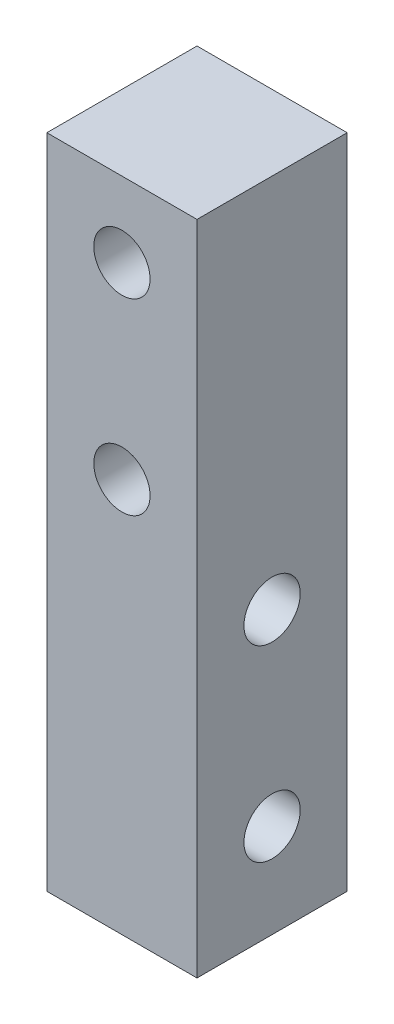
ISO-10303-21;
HEADER;
FILE_DESCRIPTION(('STEP AP214'),'2;1');
FILE_NAME('part.step','',(''),(''),'','','');
FILE_SCHEMA(('AUTOMOTIVE_DESIGN { 1 0 10303 214 1 1 1 1 }'));
ENDSEC;
DATA;
#1=APPLICATION_CONTEXT('core data for automotive mechanical design processes');
#2=APPLICATION_PROTOCOL_DEFINITION('international standard','automotive_design',2000,#1);
#3=PRODUCT_CONTEXT('',#1,'mechanical');
#4=PRODUCT('Part','Part','',(#3));
#5=PRODUCT_RELATED_PRODUCT_CATEGORY('part','',(#4));
#6=PRODUCT_DEFINITION_FORMATION('','',#4);
#7=PRODUCT_DEFINITION_CONTEXT('part definition',#1,'design');
#8=PRODUCT_DEFINITION('design','',#6,#7);
#9=PRODUCT_DEFINITION_SHAPE('','',#8);
#10=(LENGTH_UNIT() NAMED_UNIT(*) SI_UNIT(.MILLI.,.METRE.));
#11=(NAMED_UNIT(*) PLANE_ANGLE_UNIT() SI_UNIT($,.RADIAN.));
#12=(NAMED_UNIT(*) SI_UNIT($,.STERADIAN.) SOLID_ANGLE_UNIT());
#13=UNCERTAINTY_MEASURE_WITH_UNIT(LENGTH_MEASURE(1.E-05),#10,'distance_accuracy_value','');
#14=(GEOMETRIC_REPRESENTATION_CONTEXT(3) GLOBAL_UNCERTAINTY_ASSIGNED_CONTEXT((#13)) GLOBAL_UNIT_ASSIGNED_CONTEXT((#10,
#11,#12)) REPRESENTATION_CONTEXT('',''));
#15=CARTESIAN_POINT('',(0.,0.,0.));
#16=DIRECTION('',(0.,0.,1.));
#17=DIRECTION('',(1.,0.,0.));
#18=AXIS2_PLACEMENT_3D('',#15,#16,#17);
#19=CARTESIAN_POINT('',(4.,35.,-4.));
#20=DIRECTION('',(-1.,0.,0.));
#21=DIRECTION('',(0.,0.,1.));
#22=AXIS2_PLACEMENT_3D('',#19,#20,#21);
#23=PLANE('',#22);
#24=CARTESIAN_POINT('',(4.,15.,0.));
#25=DIRECTION('',(1.,0.,0.));
#26=DIRECTION('',(0.,0.,-1.));
#27=AXIS2_PLACEMENT_3D('',#24,#25,#26);
#28=CIRCLE('',#27,1.5);
#29=CARTESIAN_POINT('',(4.,15.,-1.5));
#30=VERTEX_POINT('',#29);
#31=EDGE_CURVE('E140',#30,#30,#28,.T.);
#32=ORIENTED_EDGE('',*,*,#31,.F.);
#33=EDGE_LOOP('',(#32));
#34=FACE_BOUND('',#33,.T.);
#35=CARTESIAN_POINT('',(4.,5.,0.));
#36=DIRECTION('',(1.,0.,0.));
#37=DIRECTION('',(0.,0.,-1.));
#38=AXIS2_PLACEMENT_3D('',#35,#36,#37);
#39=CIRCLE('',#38,1.5);
#40=CARTESIAN_POINT('',(4.,5.,-1.5));
#41=VERTEX_POINT('',#40);
#42=EDGE_CURVE('E134',#41,#41,#39,.T.);
#43=ORIENTED_EDGE('',*,*,#42,.F.);
#44=EDGE_LOOP('',(#43));
#45=FACE_BOUND('',#44,.T.);
#46=DIRECTION('',(0.,0.,-1.));
#47=VECTOR('',#46,1.);
#48=CARTESIAN_POINT('',(4.,0.,-4.));
#49=LINE('',#48,#47);
#50=CARTESIAN_POINT('',(4.,0.,4.));
#51=VERTEX_POINT('',#50);
#52=CARTESIAN_POINT('',(4.,0.,-4.));
#53=VERTEX_POINT('',#52);
#54=EDGE_CURVE('E108',#51,#53,#49,.T.);
#55=ORIENTED_EDGE('',*,*,#54,.T.);
#56=DIRECTION('',(0.,-1.,0.));
#57=VECTOR('',#56,1.);
#58=CARTESIAN_POINT('',(4.,35.,-4.));
#59=LINE('',#58,#57);
#60=CARTESIAN_POINT('',(4.,35.,-4.));
#61=VERTEX_POINT('',#60);
#62=EDGE_CURVE('E13',#61,#53,#59,.T.);
#63=ORIENTED_EDGE('',*,*,#62,.F.);
#64=DIRECTION('',(0.,0.,-1.));
#65=VECTOR('',#64,1.);
#66=CARTESIAN_POINT('',(4.,35.,-4.));
#67=LINE('',#66,#65);
#68=CARTESIAN_POINT('',(4.,35.,4.));
#69=VERTEX_POINT('',#68);
#70=EDGE_CURVE('E96',#69,#61,#67,.T.);
#71=ORIENTED_EDGE('',*,*,#70,.F.);
#72=DIRECTION('',(0.,-1.,0.));
#73=VECTOR('',#72,1.);
#74=CARTESIAN_POINT('',(4.,35.,4.));
#75=LINE('',#74,#73);
#76=EDGE_CURVE('E104',#69,#51,#75,.T.);
#77=ORIENTED_EDGE('',*,*,#76,.T.);
#78=EDGE_LOOP('',(#55,#63,#71,#77));
#79=FACE_BOUND('',#78,.T.);
#80=ADVANCED_FACE('F45',(#34,#45,#79),#23,.F.);
#81=CARTESIAN_POINT('',(-4.,35.,-4.));
#82=DIRECTION('',(0.,0.,1.));
#83=DIRECTION('',(1.,0.,0.));
#84=AXIS2_PLACEMENT_3D('',#81,#82,#83);
#85=PLANE('',#84);
#86=CARTESIAN_POINT('',(0.,31.,-4.));
#87=DIRECTION('',(0.,0.,-1.));
#88=DIRECTION('',(-1.,0.,0.));
#89=AXIS2_PLACEMENT_3D('',#86,#87,#88);
#90=CIRCLE('',#89,1.5);
#91=CARTESIAN_POINT('',(-1.5,31.,-4.));
#92=VERTEX_POINT('',#91);
#93=EDGE_CURVE('E129',#92,#92,#90,.T.);
#94=ORIENTED_EDGE('',*,*,#93,.F.);
#95=EDGE_LOOP('',(#94));
#96=FACE_BOUND('',#95,.T.);
#97=CARTESIAN_POINT('',(0.,21.,-4.));
#98=DIRECTION('',(0.,0.,-1.));
#99=DIRECTION('',(-1.,0.,0.));
#100=AXIS2_PLACEMENT_3D('',#97,#98,#99);
#101=CIRCLE('',#100,1.5);
#102=CARTESIAN_POINT('',(-1.5,21.,-4.));
#103=VERTEX_POINT('',#102);
#104=EDGE_CURVE('E122',#103,#103,#101,.T.);
#105=ORIENTED_EDGE('',*,*,#104,.F.);
#106=EDGE_LOOP('',(#105));
#107=FACE_BOUND('',#106,.T.);
#108=DIRECTION('',(-1.,0.,0.));
#109=VECTOR('',#108,1.);
#110=CARTESIAN_POINT('',(-4.,0.,-4.));
#111=LINE('',#110,#109);
#112=CARTESIAN_POINT('',(-4.,0.,-4.));
#113=VERTEX_POINT('',#112);
#114=EDGE_CURVE('E100',#53,#113,#111,.T.);
#115=ORIENTED_EDGE('',*,*,#114,.T.);
#116=DIRECTION('',(0.,-1.,0.));
#117=VECTOR('',#116,1.);
#118=CARTESIAN_POINT('',(-4.,35.,-4.));
#119=LINE('',#118,#117);
#120=CARTESIAN_POINT('',(-4.,35.,-4.));
#121=VERTEX_POINT('',#120);
#122=EDGE_CURVE('E53',#121,#113,#119,.T.);
#123=ORIENTED_EDGE('',*,*,#122,.F.);
#124=DIRECTION('',(-1.,0.,0.));
#125=VECTOR('',#124,1.);
#126=CARTESIAN_POINT('',(-4.,35.,-4.));
#127=LINE('',#126,#125);
#128=EDGE_CURVE('E91',#61,#121,#127,.T.);
#129=ORIENTED_EDGE('',*,*,#128,.F.);
#130=ORIENTED_EDGE('',*,*,#62,.T.);
#131=EDGE_LOOP('',(#115,#123,#129,#130));
#132=FACE_BOUND('',#131,.T.);
#133=ADVANCED_FACE('F99',(#96,#107,#132),#85,.F.);
#134=CARTESIAN_POINT('',(-4.,35.,-4.));
#135=DIRECTION('',(1.,0.,0.));
#136=DIRECTION('',(0.,0.,-1.));
#137=AXIS2_PLACEMENT_3D('',#134,#135,#136);
#138=PLANE('',#137);
#139=CARTESIAN_POINT('',(-4.,15.,0.));
#140=DIRECTION('',(1.,0.,0.));
#141=DIRECTION('',(0.,0.,-1.));
#142=AXIS2_PLACEMENT_3D('',#139,#140,#141);
#143=CIRCLE('',#142,1.5);
#144=CARTESIAN_POINT('',(-4.,15.,-1.5));
#145=VERTEX_POINT('',#144);
#146=EDGE_CURVE('E126',#145,#145,#143,.T.);
#147=ORIENTED_EDGE('',*,*,#146,.T.);
#148=EDGE_LOOP('',(#147));
#149=FACE_BOUND('',#148,.T.);
#150=CARTESIAN_POINT('',(-4.,5.,0.));
#151=DIRECTION('',(1.,0.,0.));
#152=DIRECTION('',(0.,0.,-1.));
#153=AXIS2_PLACEMENT_3D('',#150,#151,#152);
#154=CIRCLE('',#153,1.5);
#155=CARTESIAN_POINT('',(-4.,5.,-1.5));
#156=VERTEX_POINT('',#155);
#157=EDGE_CURVE('E137',#156,#156,#154,.T.);
#158=ORIENTED_EDGE('',*,*,#157,.T.);
#159=EDGE_LOOP('',(#158));
#160=FACE_BOUND('',#159,.T.);
#161=DIRECTION('',(0.,0.,1.));
#162=VECTOR('',#161,1.);
#163=CARTESIAN_POINT('',(-4.,0.,-4.));
#164=LINE('',#163,#162);
#165=CARTESIAN_POINT('',(-4.,0.,4.));
#166=VERTEX_POINT('',#165);
#167=EDGE_CURVE('E78',#113,#166,#164,.T.);
#168=ORIENTED_EDGE('',*,*,#167,.T.);
#169=DIRECTION('',(0.,-1.,0.));
#170=VECTOR('',#169,1.);
#171=CARTESIAN_POINT('',(-4.,35.,4.));
#172=LINE('',#171,#170);
#173=CARTESIAN_POINT('',(-4.,35.,4.));
#174=VERTEX_POINT('',#173);
#175=EDGE_CURVE('E101',#174,#166,#172,.T.);
#176=ORIENTED_EDGE('',*,*,#175,.F.);
#177=DIRECTION('',(0.,0.,1.));
#178=VECTOR('',#177,1.);
#179=CARTESIAN_POINT('',(-4.,35.,-4.));
#180=LINE('',#179,#178);
#181=EDGE_CURVE('E94',#121,#174,#180,.T.);
#182=ORIENTED_EDGE('',*,*,#181,.F.);
#183=ORIENTED_EDGE('',*,*,#122,.T.);
#184=EDGE_LOOP('',(#168,#176,#182,#183));
#185=FACE_BOUND('',#184,.T.);
#186=ADVANCED_FACE('F102',(#149,#160,#185),#138,.F.);
#187=CARTESIAN_POINT('',(-4.,35.,4.));
#188=DIRECTION('',(0.,0.,-1.));
#189=DIRECTION('',(-1.,0.,0.));
#190=AXIS2_PLACEMENT_3D('',#187,#188,#189);
#191=PLANE('',#190);
#192=CARTESIAN_POINT('',(0.,31.,4.));
#193=DIRECTION('',(0.,0.,-1.));
#194=DIRECTION('',(-1.,0.,0.));
#195=AXIS2_PLACEMENT_3D('',#192,#193,#194);
#196=CIRCLE('',#195,1.5);
#197=CARTESIAN_POINT('',(-1.5,31.,4.));
#198=VERTEX_POINT('',#197);
#199=EDGE_CURVE('E111',#198,#198,#196,.T.);
#200=ORIENTED_EDGE('',*,*,#199,.T.);
#201=EDGE_LOOP('',(#200));
#202=FACE_BOUND('',#201,.T.);
#203=CARTESIAN_POINT('',(0.,21.,4.));
#204=DIRECTION('',(0.,0.,-1.));
#205=DIRECTION('',(-1.,0.,0.));
#206=AXIS2_PLACEMENT_3D('',#203,#204,#205);
#207=CIRCLE('',#206,1.5);
#208=CARTESIAN_POINT('',(-1.5,21.,4.));
#209=VERTEX_POINT('',#208);
#210=EDGE_CURVE('E125',#209,#209,#207,.T.);
#211=ORIENTED_EDGE('',*,*,#210,.T.);
#212=EDGE_LOOP('',(#211));
#213=FACE_BOUND('',#212,.T.);
#214=DIRECTION('',(1.,0.,0.));
#215=VECTOR('',#214,1.);
#216=CARTESIAN_POINT('',(-4.,0.,4.));
#217=LINE('',#216,#215);
#218=EDGE_CURVE('E84',#166,#51,#217,.T.);
#219=ORIENTED_EDGE('',*,*,#218,.T.);
#220=ORIENTED_EDGE('',*,*,#76,.F.);
#221=DIRECTION('',(1.,0.,0.));
#222=VECTOR('',#221,1.);
#223=CARTESIAN_POINT('',(-4.,35.,4.));
#224=LINE('',#223,#222);
#225=EDGE_CURVE('E61',#174,#69,#224,.T.);
#226=ORIENTED_EDGE('',*,*,#225,.F.);
#227=ORIENTED_EDGE('',*,*,#175,.T.);
#228=EDGE_LOOP('',(#219,#220,#226,#227));
#229=FACE_BOUND('',#228,.T.);
#230=ADVANCED_FACE('F116',(#202,#213,#229),#191,.F.);
#231=CARTESIAN_POINT('',(0.,35.,0.));
#232=DIRECTION('',(0.,1.,0.));
#233=DIRECTION('',(0.,0.,1.));
#234=AXIS2_PLACEMENT_3D('',#231,#232,#233);
#235=PLANE('',#234);
#236=ORIENTED_EDGE('',*,*,#70,.T.);
#237=ORIENTED_EDGE('',*,*,#128,.T.);
#238=ORIENTED_EDGE('',*,*,#181,.T.);
#239=ORIENTED_EDGE('',*,*,#225,.T.);
#240=EDGE_LOOP('',(#236,#237,#238,#239));
#241=FACE_BOUND('',#240,.T.);
#242=ADVANCED_FACE('F92',(#241),#235,.T.);
#243=CARTESIAN_POINT('',(0.,0.,0.));
#244=DIRECTION('',(0.,1.,0.));
#245=DIRECTION('',(0.,0.,1.));
#246=AXIS2_PLACEMENT_3D('',#243,#244,#245);
#247=PLANE('',#246);
#248=ORIENTED_EDGE('',*,*,#54,.F.);
#249=ORIENTED_EDGE('',*,*,#218,.F.);
#250=ORIENTED_EDGE('',*,*,#167,.F.);
#251=ORIENTED_EDGE('',*,*,#114,.F.);
#252=EDGE_LOOP('',(#248,#249,#250,#251));
#253=FACE_BOUND('',#252,.T.);
#254=ADVANCED_FACE('F119',(#253),#247,.F.);
#255=CARTESIAN_POINT('',(0.,21.,4.));
#256=DIRECTION('',(0.,0.,-1.));
#257=DIRECTION('',(-1.,0.,0.));
#258=AXIS2_PLACEMENT_3D('',#255,#256,#257);
#259=CYLINDRICAL_SURFACE('',#258,1.5);
#260=ORIENTED_EDGE('',*,*,#210,.F.);
#261=EDGE_LOOP('',(#260));
#262=FACE_BOUND('',#261,.T.);
#263=ORIENTED_EDGE('',*,*,#104,.T.);
#264=EDGE_LOOP('',(#263));
#265=FACE_BOUND('',#264,.T.);
#266=ADVANCED_FACE('F166',(#262,#265),#259,.F.);
#267=CARTESIAN_POINT('',(0.,31.,4.));
#268=DIRECTION('',(0.,0.,-1.));
#269=DIRECTION('',(-1.,0.,0.));
#270=AXIS2_PLACEMENT_3D('',#267,#268,#269);
#271=CYLINDRICAL_SURFACE('',#270,1.5);
#272=ORIENTED_EDGE('',*,*,#199,.F.);
#273=EDGE_LOOP('',(#272));
#274=FACE_BOUND('',#273,.T.);
#275=ORIENTED_EDGE('',*,*,#93,.T.);
#276=EDGE_LOOP('',(#275));
#277=FACE_BOUND('',#276,.T.);
#278=ADVANCED_FACE('F160',(#274,#277),#271,.F.);
#279=CARTESIAN_POINT('',(-4.,5.,0.));
#280=DIRECTION('',(1.,0.,0.));
#281=DIRECTION('',(0.,0.,-1.));
#282=AXIS2_PLACEMENT_3D('',#279,#280,#281);
#283=CYLINDRICAL_SURFACE('',#282,1.5);
#284=ORIENTED_EDGE('',*,*,#157,.F.);
#285=EDGE_LOOP('',(#284));
#286=FACE_BOUND('',#285,.T.);
#287=ORIENTED_EDGE('',*,*,#42,.T.);
#288=EDGE_LOOP('',(#287));
#289=FACE_BOUND('',#288,.T.);
#290=ADVANCED_FACE('F151',(#286,#289),#283,.F.);
#291=CARTESIAN_POINT('',(-4.,15.,0.));
#292=DIRECTION('',(1.,0.,0.));
#293=DIRECTION('',(0.,0.,-1.));
#294=AXIS2_PLACEMENT_3D('',#291,#292,#293);
#295=CYLINDRICAL_SURFACE('',#294,1.5);
#296=ORIENTED_EDGE('',*,*,#146,.F.);
#297=EDGE_LOOP('',(#296));
#298=FACE_BOUND('',#297,.T.);
#299=ORIENTED_EDGE('',*,*,#31,.T.);
#300=EDGE_LOOP('',(#299));
#301=FACE_BOUND('',#300,.T.);
#302=ADVANCED_FACE('F148',(#298,#301),#295,.F.);
#303=CLOSED_SHELL('',(#80,#133,#186,#230,#242,#254,#266,#278,#290,#302));
#304=MANIFOLD_SOLID_BREP('B2',#303);
#305=ADVANCED_BREP_SHAPE_REPRESENTATION('',(#18,#304),#14);
#306=SHAPE_DEFINITION_REPRESENTATION(#9,#305);
ENDSEC;
END-ISO-10303-21;
